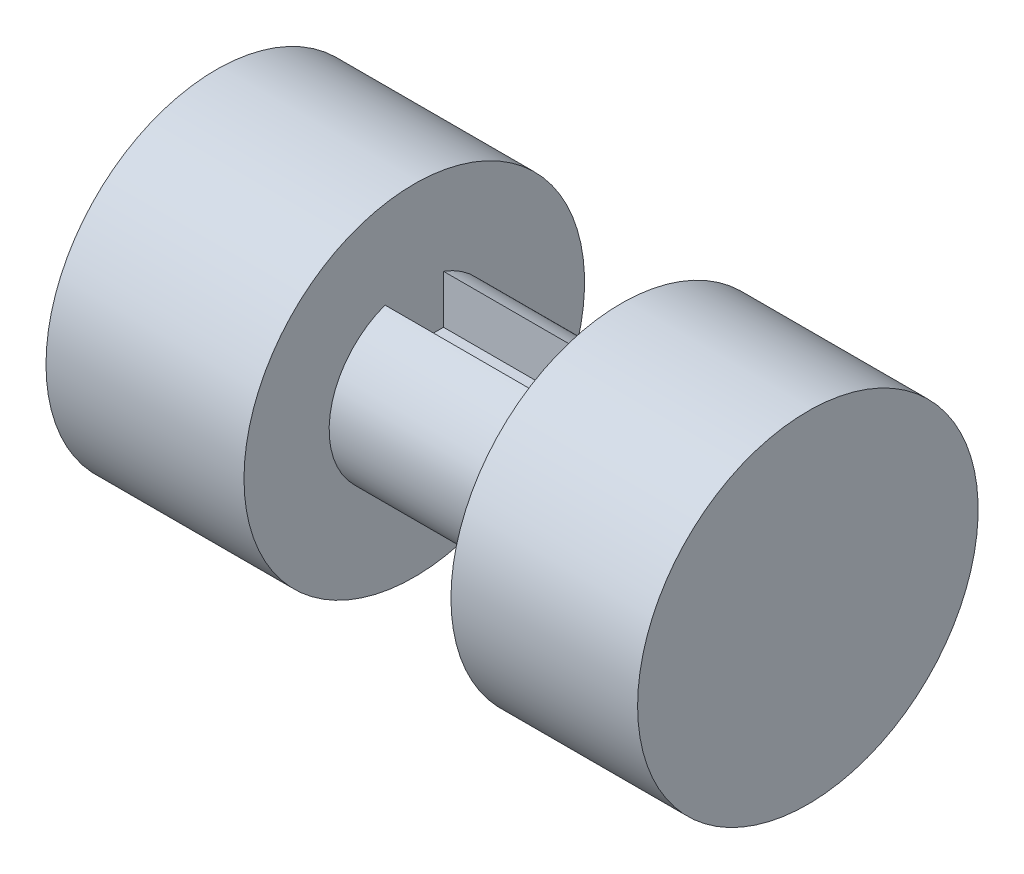
ISO-10303-21;
HEADER;
FILE_DESCRIPTION(('STEP AP214'),'2;1');
FILE_NAME('part.step','',(''),(''),'','','');
FILE_SCHEMA(('AUTOMOTIVE_DESIGN { 1 0 10303 214 1 1 1 1 }'));
ENDSEC;
DATA;
#1=APPLICATION_CONTEXT('core data for automotive mechanical design processes');
#2=APPLICATION_PROTOCOL_DEFINITION('international standard','automotive_design',2000,#1);
#3=PRODUCT_CONTEXT('',#1,'mechanical');
#4=PRODUCT('Part','Part','',(#3));
#5=PRODUCT_RELATED_PRODUCT_CATEGORY('part','',(#4));
#6=PRODUCT_DEFINITION_FORMATION('','',#4);
#7=PRODUCT_DEFINITION_CONTEXT('part definition',#1,'design');
#8=PRODUCT_DEFINITION('design','',#6,#7);
#9=PRODUCT_DEFINITION_SHAPE('','',#8);
#10=(LENGTH_UNIT() NAMED_UNIT(*) SI_UNIT(.MILLI.,.METRE.));
#11=(NAMED_UNIT(*) PLANE_ANGLE_UNIT() SI_UNIT($,.RADIAN.));
#12=(NAMED_UNIT(*) SI_UNIT($,.STERADIAN.) SOLID_ANGLE_UNIT());
#13=UNCERTAINTY_MEASURE_WITH_UNIT(LENGTH_MEASURE(1.E-05),#10,'distance_accuracy_value','');
#14=(GEOMETRIC_REPRESENTATION_CONTEXT(3) GLOBAL_UNCERTAINTY_ASSIGNED_CONTEXT((#13)) GLOBAL_UNIT_ASSIGNED_CONTEXT((#10,
#11,#12)) REPRESENTATION_CONTEXT('',''));
#15=CARTESIAN_POINT('',(0.,0.,0.));
#16=DIRECTION('',(0.,0.,1.));
#17=DIRECTION('',(1.,0.,0.));
#18=AXIS2_PLACEMENT_3D('',#15,#16,#17);
#19=CARTESIAN_POINT('',(-44.0036148694484,37.8431460674157,0.));
#20=DIRECTION('',(1.,0.,0.));
#21=DIRECTION('',(0.,0.,-1.));
#22=AXIS2_PLACEMENT_3D('',#19,#20,#21);
#23=PLANE('',#22);
#24=CARTESIAN_POINT('',(-44.0036148694484,0.,0.));
#25=DIRECTION('',(-1.,0.,0.));
#26=DIRECTION('',(0.,0.,1.));
#27=AXIS2_PLACEMENT_3D('',#24,#25,#26);
#28=CIRCLE('',#27,37.8431460674157);
#29=CARTESIAN_POINT('',(-44.0036148694484,0.,37.8431460674157));
#30=VERTEX_POINT('',#29);
#31=EDGE_CURVE('E123',#30,#30,#28,.T.);
#32=ORIENTED_EDGE('',*,*,#31,.T.);
#33=EDGE_LOOP('',(#32));
#34=FACE_BOUND('',#33,.T.);
#35=ADVANCED_FACE('F39',(#34),#23,.F.);
#36=CARTESIAN_POINT('',(87.477059287855,0.,0.));
#37=DIRECTION('',(-1.,0.,0.));
#38=DIRECTION('',(0.,0.,1.));
#39=AXIS2_PLACEMENT_3D('',#36,#37,#38);
#40=PLANE('',#39);
#41=CARTESIAN_POINT('',(87.477059287855,0.,0.));
#42=DIRECTION('',(-1.,0.,0.));
#43=DIRECTION('',(0.,0.,1.));
#44=AXIS2_PLACEMENT_3D('',#41,#42,#43);
#45=CIRCLE('',#44,37.8431460674157);
#46=CARTESIAN_POINT('',(87.477059287855,0.,37.8431460674157));
#47=VERTEX_POINT('',#46);
#48=EDGE_CURVE('E11',#47,#47,#45,.T.);
#49=ORIENTED_EDGE('',*,*,#48,.F.);
#50=EDGE_LOOP('',(#49));
#51=FACE_BOUND('',#50,.T.);
#52=ADVANCED_FACE('F143',(#51),#40,.F.);
#53=CARTESIAN_POINT('',(-44.0036148694484,0.,0.));
#54=DIRECTION('',(-1.,0.,0.));
#55=DIRECTION('',(0.,0.,1.));
#56=AXIS2_PLACEMENT_3D('',#53,#54,#55);
#57=CYLINDRICAL_SURFACE('',#56,37.8431460674157);
#58=CARTESIAN_POINT('',(45.9951491754955,0.,0.));
#59=DIRECTION('',(-1.,0.,0.));
#60=DIRECTION('',(0.,0.,1.));
#61=AXIS2_PLACEMENT_3D('',#58,#59,#60);
#62=CIRCLE('',#61,37.8431460674157);
#63=CARTESIAN_POINT('',(45.9951491754955,0.,37.8431460674157));
#64=VERTEX_POINT('',#63);
#65=EDGE_CURVE('E47',#64,#64,#62,.T.);
#66=ORIENTED_EDGE('',*,*,#65,.F.);
#67=EDGE_LOOP('',(#66));
#68=FACE_BOUND('',#67,.T.);
#69=ORIENTED_EDGE('',*,*,#48,.T.);
#70=EDGE_LOOP('',(#69));
#71=FACE_BOUND('',#70,.T.);
#72=ADVANCED_FACE('F140',(#68,#71),#57,.T.);
#73=CARTESIAN_POINT('',(45.9951491754955,37.8431460674157,0.));
#74=DIRECTION('',(1.,0.,0.));
#75=DIRECTION('',(0.,0.,-1.));
#76=AXIS2_PLACEMENT_3D('',#73,#74,#75);
#77=PLANE('',#76);
#78=DIRECTION('',(0.,1.,0.));
#79=VECTOR('',#78,1.);
#80=CARTESIAN_POINT('',(45.9951491754955,7.,6.5));
#81=LINE('',#80,#79);
#82=CARTESIAN_POINT('',(45.9951491754955,7.,6.5));
#83=VERTEX_POINT('',#82);
#84=CARTESIAN_POINT('',(45.9951491754955,17.7700851452642,6.5));
#85=VERTEX_POINT('',#84);
#86=EDGE_CURVE('E110',#83,#85,#81,.T.);
#87=ORIENTED_EDGE('',*,*,#86,.T.);
#88=CARTESIAN_POINT('',(45.9951491754955,0.,0.));
#89=DIRECTION('',(-1.,0.,0.));
#90=DIRECTION('',(0.,0.,1.));
#91=AXIS2_PLACEMENT_3D('',#88,#89,#90);
#92=CIRCLE('',#91,18.9215730337079);
#93=CARTESIAN_POINT('',(45.9951491754955,17.7700851452642,-6.5));
#94=VERTEX_POINT('',#93);
#95=EDGE_CURVE('E86',#94,#85,#92,.T.);
#96=ORIENTED_EDGE('',*,*,#95,.F.);
#97=DIRECTION('',(0.,1.,0.));
#98=VECTOR('',#97,1.);
#99=CARTESIAN_POINT('',(45.9951491754955,7.,-6.5));
#100=LINE('',#99,#98);
#101=CARTESIAN_POINT('',(45.9951491754955,7.,-6.5));
#102=VERTEX_POINT('',#101);
#103=EDGE_CURVE('E54',#102,#94,#100,.T.);
#104=ORIENTED_EDGE('',*,*,#103,.F.);
#105=DIRECTION('',(0.,0.,-1.));
#106=VECTOR('',#105,1.);
#107=CARTESIAN_POINT('',(45.9951491754955,7.,-6.5));
#108=LINE('',#107,#106);
#109=EDGE_CURVE('E83',#83,#102,#108,.T.);
#110=ORIENTED_EDGE('',*,*,#109,.F.);
#111=EDGE_LOOP('',(#87,#96,#104,#110));
#112=FACE_BOUND('',#111,.T.);
#113=ORIENTED_EDGE('',*,*,#65,.T.);
#114=EDGE_LOOP('',(#113));
#115=FACE_BOUND('',#114,.T.);
#116=ADVANCED_FACE('F80',(#112,#115),#77,.F.);
#117=CARTESIAN_POINT('',(-44.0036148694484,0.,0.));
#118=DIRECTION('',(-1.,0.,0.));
#119=DIRECTION('',(0.,0.,1.));
#120=AXIS2_PLACEMENT_3D('',#117,#118,#119);
#121=CYLINDRICAL_SURFACE('',#120,18.9215730337079);
#122=ORIENTED_EDGE('',*,*,#95,.T.);
#123=DIRECTION('',(-1.,0.,0.));
#124=VECTOR('',#123,1.);
#125=CARTESIAN_POINT('',(-44.0036148694484,17.7700851452642,6.5));
#126=LINE('',#125,#124);
#127=CARTESIAN_POINT('',(0.,17.7700851452642,6.5));
#128=VERTEX_POINT('',#127);
#129=EDGE_CURVE('E62',#85,#128,#126,.T.);
#130=ORIENTED_EDGE('',*,*,#129,.T.);
#131=CARTESIAN_POINT('',(0.,0.,0.));
#132=DIRECTION('',(-1.,0.,0.));
#133=DIRECTION('',(0.,0.,1.));
#134=AXIS2_PLACEMENT_3D('',#131,#132,#133);
#135=CIRCLE('',#134,18.9215730337079);
#136=CARTESIAN_POINT('',(0.,17.7700851452642,-6.5));
#137=VERTEX_POINT('',#136);
#138=EDGE_CURVE('E131',#137,#128,#135,.T.);
#139=ORIENTED_EDGE('',*,*,#138,.F.);
#140=DIRECTION('',(-1.,0.,0.));
#141=VECTOR('',#140,1.);
#142=CARTESIAN_POINT('',(-44.0036148694484,17.7700851452642,-6.5));
#143=LINE('',#142,#141);
#144=EDGE_CURVE('E113',#137,#94,#143,.F.);
#145=ORIENTED_EDGE('',*,*,#144,.T.);
#146=EDGE_LOOP('',(#122,#130,#139,#145));
#147=FACE_BOUND('',#146,.T.);
#148=ADVANCED_FACE('F155',(#147),#121,.T.);
#149=CARTESIAN_POINT('',(0.,18.9215730337079,0.));
#150=DIRECTION('',(-1.,0.,0.));
#151=DIRECTION('',(0.,0.,1.));
#152=AXIS2_PLACEMENT_3D('',#149,#150,#151);
#153=PLANE('',#152);
#154=ORIENTED_EDGE('',*,*,#138,.T.);
#155=DIRECTION('',(0.,1.,0.));
#156=VECTOR('',#155,1.);
#157=CARTESIAN_POINT('',(0.,7.,6.5));
#158=LINE('',#157,#156);
#159=CARTESIAN_POINT('',(0.,7.,6.5));
#160=VERTEX_POINT('',#159);
#161=EDGE_CURVE('E114',#160,#128,#158,.T.);
#162=ORIENTED_EDGE('',*,*,#161,.F.);
#163=DIRECTION('',(0.,0.,1.));
#164=VECTOR('',#163,1.);
#165=CARTESIAN_POINT('',(0.,7.,-6.5));
#166=LINE('',#165,#164);
#167=CARTESIAN_POINT('',(0.,7.,-6.5));
#168=VERTEX_POINT('',#167);
#169=EDGE_CURVE('E99',#168,#160,#166,.T.);
#170=ORIENTED_EDGE('',*,*,#169,.F.);
#171=DIRECTION('',(0.,1.,0.));
#172=VECTOR('',#171,1.);
#173=CARTESIAN_POINT('',(0.,7.,-6.5));
#174=LINE('',#173,#172);
#175=EDGE_CURVE('E88',#168,#137,#174,.T.);
#176=ORIENTED_EDGE('',*,*,#175,.T.);
#177=EDGE_LOOP('',(#154,#162,#170,#176));
#178=FACE_BOUND('',#177,.T.);
#179=CARTESIAN_POINT('',(0.,0.,0.));
#180=DIRECTION('',(-1.,0.,0.));
#181=DIRECTION('',(0.,0.,1.));
#182=AXIS2_PLACEMENT_3D('',#179,#180,#181);
#183=CIRCLE('',#182,37.8431460674157);
#184=CARTESIAN_POINT('',(0.,0.,37.8431460674157));
#185=VERTEX_POINT('',#184);
#186=EDGE_CURVE('E127',#185,#185,#183,.T.);
#187=ORIENTED_EDGE('',*,*,#186,.F.);
#188=EDGE_LOOP('',(#187));
#189=FACE_BOUND('',#188,.T.);
#190=ADVANCED_FACE('F158',(#178,#189),#153,.F.);
#191=CARTESIAN_POINT('',(-44.0036148694484,0.,0.));
#192=DIRECTION('',(-1.,0.,0.));
#193=DIRECTION('',(0.,0.,1.));
#194=AXIS2_PLACEMENT_3D('',#191,#192,#193);
#195=CYLINDRICAL_SURFACE('',#194,37.8431460674157);
#196=ORIENTED_EDGE('',*,*,#31,.F.);
#197=EDGE_LOOP('',(#196));
#198=FACE_BOUND('',#197,.T.);
#199=ORIENTED_EDGE('',*,*,#186,.T.);
#200=EDGE_LOOP('',(#199));
#201=FACE_BOUND('',#200,.T.);
#202=ADVANCED_FACE('F162',(#198,#201),#195,.T.);
#203=CARTESIAN_POINT('',(0.,7.,6.5));
#204=DIRECTION('',(0.,0.,1.));
#205=DIRECTION('',(1.,0.,0.));
#206=AXIS2_PLACEMENT_3D('',#203,#204,#205);
#207=PLANE('',#206);
#208=ORIENTED_EDGE('',*,*,#86,.F.);
#209=DIRECTION('',(1.,0.,0.));
#210=VECTOR('',#209,1.);
#211=CARTESIAN_POINT('',(0.,7.,6.5));
#212=LINE('',#211,#210);
#213=EDGE_CURVE('E89',#160,#83,#212,.T.);
#214=ORIENTED_EDGE('',*,*,#213,.F.);
#215=ORIENTED_EDGE('',*,*,#161,.T.);
#216=ORIENTED_EDGE('',*,*,#129,.F.);
#217=EDGE_LOOP('',(#208,#214,#215,#216));
#218=FACE_BOUND('',#217,.T.);
#219=ADVANCED_FACE('F166',(#218),#207,.F.);
#220=CARTESIAN_POINT('',(0.,7.,-6.5));
#221=DIRECTION('',(0.,0.,-1.));
#222=DIRECTION('',(-1.,0.,0.));
#223=AXIS2_PLACEMENT_3D('',#220,#221,#222);
#224=PLANE('',#223);
#225=ORIENTED_EDGE('',*,*,#175,.F.);
#226=DIRECTION('',(-1.,0.,0.));
#227=VECTOR('',#226,1.);
#228=CARTESIAN_POINT('',(0.,7.,-6.5));
#229=LINE('',#228,#227);
#230=EDGE_CURVE('E92',#102,#168,#229,.T.);
#231=ORIENTED_EDGE('',*,*,#230,.F.);
#232=ORIENTED_EDGE('',*,*,#103,.T.);
#233=ORIENTED_EDGE('',*,*,#144,.F.);
#234=EDGE_LOOP('',(#225,#231,#232,#233));
#235=FACE_BOUND('',#234,.T.);
#236=ADVANCED_FACE('F93',(#235),#224,.F.);
#237=CARTESIAN_POINT('',(0.,7.,0.));
#238=DIRECTION('',(0.,1.,0.));
#239=DIRECTION('',(0.,0.,1.));
#240=AXIS2_PLACEMENT_3D('',#237,#238,#239);
#241=PLANE('',#240);
#242=ORIENTED_EDGE('',*,*,#109,.T.);
#243=ORIENTED_EDGE('',*,*,#230,.T.);
#244=ORIENTED_EDGE('',*,*,#169,.T.);
#245=ORIENTED_EDGE('',*,*,#213,.T.);
#246=EDGE_LOOP('',(#242,#243,#244,#245));
#247=FACE_BOUND('',#246,.T.);
#248=ADVANCED_FACE('F101',(#247),#241,.T.);
#249=CLOSED_SHELL('',(#35,#52,#72,#116,#148,#190,#202,#219,#236,#248));
#250=MANIFOLD_SOLID_BREP('B2',#249);
#251=ADVANCED_BREP_SHAPE_REPRESENTATION('',(#18,#250),#14);
#252=SHAPE_DEFINITION_REPRESENTATION(#9,#251);
ENDSEC;
END-ISO-10303-21;
